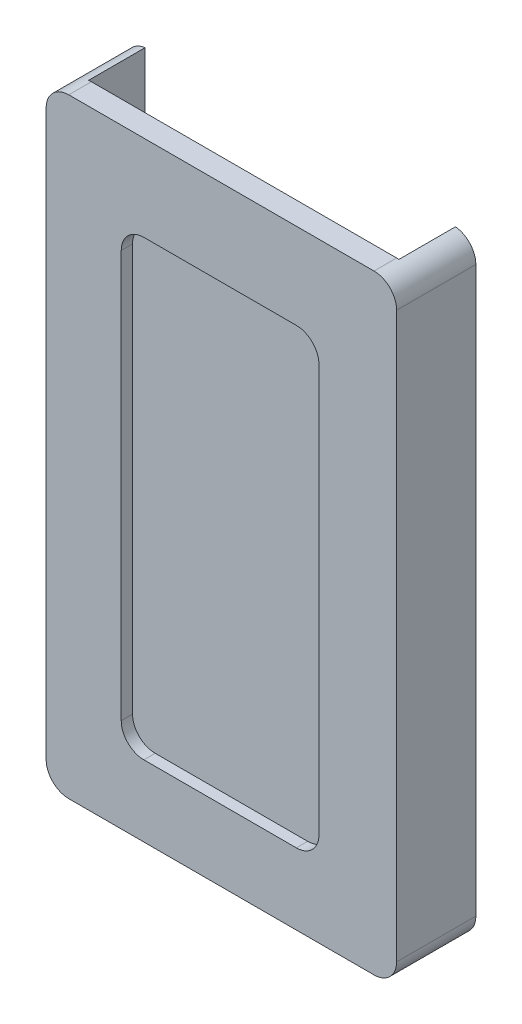
ISO-10303-21;
HEADER;
FILE_DESCRIPTION(('STEP AP214'),'2;1');
FILE_NAME('part.step','',(''),(''),'','','');
FILE_SCHEMA(('AUTOMOTIVE_DESIGN { 1 0 10303 214 1 1 1 1 }'));
ENDSEC;
DATA;
#1=APPLICATION_CONTEXT('core data for automotive mechanical design processes');
#2=APPLICATION_PROTOCOL_DEFINITION('international standard','automotive_design',2000,#1);
#3=PRODUCT_CONTEXT('',#1,'mechanical');
#4=PRODUCT('Part','Part','',(#3));
#5=PRODUCT_RELATED_PRODUCT_CATEGORY('part','',(#4));
#6=PRODUCT_DEFINITION_FORMATION('','',#4);
#7=PRODUCT_DEFINITION_CONTEXT('part definition',#1,'design');
#8=PRODUCT_DEFINITION('design','',#6,#7);
#9=PRODUCT_DEFINITION_SHAPE('','',#8);
#10=(LENGTH_UNIT() NAMED_UNIT(*) SI_UNIT(.MILLI.,.METRE.));
#11=(NAMED_UNIT(*) PLANE_ANGLE_UNIT() SI_UNIT($,.RADIAN.));
#12=(NAMED_UNIT(*) SI_UNIT($,.STERADIAN.) SOLID_ANGLE_UNIT());
#13=UNCERTAINTY_MEASURE_WITH_UNIT(LENGTH_MEASURE(1.E-05),#10,'distance_accuracy_value','');
#14=(GEOMETRIC_REPRESENTATION_CONTEXT(3) GLOBAL_UNCERTAINTY_ASSIGNED_CONTEXT((#13)) GLOBAL_UNIT_ASSIGNED_CONTEXT((#10,
#11,#12)) REPRESENTATION_CONTEXT('',''));
#15=CARTESIAN_POINT('',(0.,0.,0.));
#16=DIRECTION('',(0.,0.,1.));
#17=DIRECTION('',(1.,0.,0.));
#18=AXIS2_PLACEMENT_3D('',#15,#16,#17);
#19=CARTESIAN_POINT('',(0.,0.,17.));
#20=DIRECTION('',(0.,0.,-1.));
#21=DIRECTION('',(-1.,0.,0.));
#22=AXIS2_PLACEMENT_3D('',#19,#20,#21);
#23=PLANE('',#22);
#24=DIRECTION('',(1.,0.,0.));
#25=VECTOR('',#24,1.);
#26=CARTESIAN_POINT('',(36.6667067876056,-78.7564287427443,17.));
#27=LINE('',#26,#25);
#28=CARTESIAN_POINT('',(38.6667067876056,-78.7564287427443,17.));
#29=VERTEX_POINT('',#28);
#30=CARTESIAN_POINT('',(49.0700909856284,-78.7564287427443,17.));
#31=VERTEX_POINT('',#30);
#32=EDGE_CURVE('E265',#29,#31,#27,.T.);
#33=ORIENTED_EDGE('',*,*,#32,.F.);
#34=CARTESIAN_POINT('',(38.6667067876056,-76.7564287427443,17.));
#35=DIRECTION('',(0.,0.,-1.));
#36=DIRECTION('',(-1.,0.,0.));
#37=AXIS2_PLACEMENT_3D('',#34,#35,#36);
#38=CIRCLE('',#37,2.);
#39=CARTESIAN_POINT('',(36.6667067876056,-76.7564287427443,17.));
#40=VERTEX_POINT('',#39);
#41=EDGE_CURVE('E297',#29,#40,#38,.T.);
#42=ORIENTED_EDGE('',*,*,#41,.T.);
#43=DIRECTION('',(0.,-1.,0.));
#44=VECTOR('',#43,1.);
#45=CARTESIAN_POINT('',(36.6667067876056,-24.8876513413796,17.));
#46=LINE('',#45,#44);
#47=CARTESIAN_POINT('',(36.6667067876056,-26.8876513413796,17.));
#48=VERTEX_POINT('',#47);
#49=EDGE_CURVE('E270',#48,#40,#46,.T.);
#50=ORIENTED_EDGE('',*,*,#49,.F.);
#51=CARTESIAN_POINT('',(38.6667067876056,-26.8876513413796,17.));
#52=DIRECTION('',(0.,0.,-1.));
#53=DIRECTION('',(-1.,0.,0.));
#54=AXIS2_PLACEMENT_3D('',#51,#52,#53);
#55=CIRCLE('',#54,2.);
#56=CARTESIAN_POINT('',(38.4138867747377,-24.9036951823142,17.));
#57=VERTEX_POINT('',#56);
#58=EDGE_CURVE('E295',#48,#57,#55,.T.);
#59=ORIENTED_EDGE('',*,*,#58,.T.);
#60=DIRECTION('',(0.,-1.,0.));
#61=VECTOR('',#60,1.);
#62=CARTESIAN_POINT('',(38.4138867747377,-26.7599185660261,17.));
#63=LINE('',#62,#61);
#64=CARTESIAN_POINT('',(38.4138867747377,-77.1753131264585,17.));
#65=VERTEX_POINT('',#64);
#66=EDGE_CURVE('E250',#57,#65,#63,.T.);
#67=ORIENTED_EDGE('',*,*,#66,.T.);
#68=DIRECTION('',(1.,0.,0.));
#69=VECTOR('',#68,1.);
#70=CARTESIAN_POINT('',(38.4138867747377,-77.1753131264585,17.));
#71=LINE('',#70,#69);
#72=CARTESIAN_POINT('',(49.0700909856284,-77.1753131264585,17.));
#73=VERTEX_POINT('',#72);
#74=EDGE_CURVE('E257',#65,#73,#71,.T.);
#75=ORIENTED_EDGE('',*,*,#74,.T.);
#76=DIRECTION('',(0.,-1.,0.));
#77=VECTOR('',#76,1.);
#78=CARTESIAN_POINT('',(49.0700909856284,-77.1753131264585,17.));
#79=LINE('',#78,#77);
#80=EDGE_CURVE('E398',#73,#31,#79,.T.);
#81=ORIENTED_EDGE('',*,*,#80,.T.);
#82=EDGE_LOOP('',(#33,#42,#50,#59,#67,#75,#81));
#83=FACE_BOUND('',#82,.T.);
#84=ADVANCED_FACE('F59',(#83),#23,.T.);
#85=CARTESIAN_POINT('',(65.7954731172422,-26.7599185660261,22.));
#86=DIRECTION('',(1.,0.,0.));
#87=DIRECTION('',(0.,1.,0.));
#88=AXIS2_PLACEMENT_3D('',#85,#86,#87);
#89=PLANE('',#88);
#90=DIRECTION('',(0.,0.,1.));
#91=VECTOR('',#90,1.);
#92=CARTESIAN_POINT('',(65.7954731172422,-28.8876513413796,22.));
#93=LINE('',#92,#91);
#94=CARTESIAN_POINT('',(65.7954731172422,-28.8876513413796,17.));
#95=VERTEX_POINT('',#94);
#96=CARTESIAN_POINT('',(65.7954731172422,-28.8876513413796,22.));
#97=VERTEX_POINT('',#96);
#98=EDGE_CURVE('E437',#95,#97,#93,.T.);
#99=ORIENTED_EDGE('',*,*,#98,.F.);
#100=DIRECTION('',(0.,-1.,0.));
#101=VECTOR('',#100,1.);
#102=CARTESIAN_POINT('',(65.7954731172422,-26.7599185660261,17.));
#103=LINE('',#102,#101);
#104=CARTESIAN_POINT('',(65.7954731172423,-77.1753131264585,17.));
#105=VERTEX_POINT('',#104);
#106=EDGE_CURVE('E444',#95,#105,#103,.T.);
#107=ORIENTED_EDGE('',*,*,#106,.T.);
#108=DIRECTION('',(0.,0.,-1.));
#109=VECTOR('',#108,1.);
#110=CARTESIAN_POINT('',(65.7954731172423,-77.1753131264585,22.));
#111=LINE('',#110,#109);
#112=CARTESIAN_POINT('',(65.7954731172423,-77.1753131264585,22.));
#113=VERTEX_POINT('',#112);
#114=EDGE_CURVE('E258',#113,#105,#111,.T.);
#115=ORIENTED_EDGE('',*,*,#114,.F.);
#116=DIRECTION('',(0.,-1.,0.));
#117=VECTOR('',#116,1.);
#118=CARTESIAN_POINT('',(65.7954731172422,-26.7599185660261,22.));
#119=LINE('',#118,#117);
#120=EDGE_CURVE('E241',#97,#113,#119,.T.);
#121=ORIENTED_EDGE('',*,*,#120,.F.);
#122=EDGE_LOOP('',(#99,#107,#115,#121));
#123=FACE_BOUND('',#122,.T.);
#124=ADVANCED_FACE('F479',(#123),#89,.F.);
#125=DIRECTION('',(0.,-1.,0.));
#126=VECTOR('',#125,1.);
#127=CARTESIAN_POINT('',(67.6413600769126,-24.8876513413796,17.));
#128=LINE('',#127,#126);
#129=CARTESIAN_POINT('',(67.6413600769126,-26.8876513413796,17.));
#130=VERTEX_POINT('',#129);
#131=CARTESIAN_POINT('',(67.6413600769126,-76.7564287427443,17.));
#132=VERTEX_POINT('',#131);
#133=EDGE_CURVE('E267',#130,#132,#128,.T.);
#134=ORIENTED_EDGE('',*,*,#133,.T.);
#135=CARTESIAN_POINT('',(65.6413600769126,-76.7564287427443,17.));
#136=DIRECTION('',(0.,0.,-1.));
#137=DIRECTION('',(-1.,0.,0.));
#138=AXIS2_PLACEMENT_3D('',#135,#136,#137);
#139=CIRCLE('',#138,2.);
#140=CARTESIAN_POINT('',(65.6413600769126,-78.7564287427443,17.));
#141=VERTEX_POINT('',#140);
#142=EDGE_CURVE('E280',#132,#141,#139,.T.);
#143=ORIENTED_EDGE('',*,*,#142,.T.);
#144=CARTESIAN_POINT('',(55.1900802237575,-78.7564287427443,17.));
#145=VERTEX_POINT('',#144);
#146=EDGE_CURVE('E260',#145,#141,#27,.T.);
#147=ORIENTED_EDGE('',*,*,#146,.F.);
#148=DIRECTION('',(0.,-1.,0.));
#149=VECTOR('',#148,1.);
#150=CARTESIAN_POINT('',(55.1900802237575,-77.1753131264585,17.));
#151=LINE('',#150,#149);
#152=CARTESIAN_POINT('',(55.1900802237575,-77.1753131264585,17.));
#153=VERTEX_POINT('',#152);
#154=EDGE_CURVE('E404',#153,#145,#151,.T.);
#155=ORIENTED_EDGE('',*,*,#154,.F.);
#156=EDGE_CURVE('E441',#153,#105,#71,.T.);
#157=ORIENTED_EDGE('',*,*,#156,.T.);
#158=ORIENTED_EDGE('',*,*,#106,.F.);
#159=DIRECTION('',(-1.,0.,0.));
#160=VECTOR('',#159,1.);
#161=CARTESIAN_POINT('',(38.4138867747377,-28.8876513413796,17.));
#162=LINE('',#161,#160);
#163=CARTESIAN_POINT('',(65.8413296026054,-28.8876513413796,17.));
#164=VERTEX_POINT('',#163);
#165=EDGE_CURVE('E431',#164,#95,#162,.T.);
#166=ORIENTED_EDGE('',*,*,#165,.F.);
#167=DIRECTION('',(0.,1.,0.));
#168=VECTOR('',#167,1.);
#169=CARTESIAN_POINT('',(65.8413296026054,-28.8876513413796,17.));
#170=LINE('',#169,#168);
#171=CARTESIAN_POINT('',(65.8413296026054,-24.8976734046189,17.));
#172=VERTEX_POINT('',#171);
#173=EDGE_CURVE('E434',#164,#172,#170,.T.);
#174=ORIENTED_EDGE('',*,*,#173,.T.);
#175=CARTESIAN_POINT('',(65.6413600769126,-26.8876513413796,17.));
#176=DIRECTION('',(0.,0.,-1.));
#177=DIRECTION('',(-1.,0.,0.));
#178=AXIS2_PLACEMENT_3D('',#175,#176,#177);
#179=CIRCLE('',#178,2.);
#180=EDGE_CURVE('E278',#172,#130,#179,.T.);
#181=ORIENTED_EDGE('',*,*,#180,.T.);
#182=EDGE_LOOP('',(#134,#143,#147,#155,#157,#158,#166,#174,#181));
#183=FACE_BOUND('',#182,.T.);
#184=ADVANCED_FACE('F475',(#183),#23,.T.);
#185=CARTESIAN_POINT('',(36.6667067876056,-78.7564287427443,22.));
#186=DIRECTION('',(0.,1.,0.));
#187=DIRECTION('',(0.,0.,1.));
#188=AXIS2_PLACEMENT_3D('',#185,#186,#187);
#189=PLANE('',#188);
#190=ORIENTED_EDGE('',*,*,#146,.T.);
#191=DIRECTION('',(0.,0.,-1.));
#192=VECTOR('',#191,1.);
#193=CARTESIAN_POINT('',(65.6413600769126,-78.7564287427443,24.));
#194=LINE('',#193,#192);
#195=CARTESIAN_POINT('',(65.6413600769126,-78.7564287427443,24.));
#196=VERTEX_POINT('',#195);
#197=EDGE_CURVE('E285',#141,#196,#194,.F.);
#198=ORIENTED_EDGE('',*,*,#197,.T.);
#199=DIRECTION('',(1.,0.,0.));
#200=VECTOR('',#199,1.);
#201=CARTESIAN_POINT('',(36.6667067876056,-78.7564287427443,24.));
#202=LINE('',#201,#200);
#203=CARTESIAN_POINT('',(38.6667067876056,-78.7564287427443,24.));
#204=VERTEX_POINT('',#203);
#205=EDGE_CURVE('E390',#204,#196,#202,.T.);
#206=ORIENTED_EDGE('',*,*,#205,.F.);
#207=DIRECTION('',(0.,0.,-1.));
#208=VECTOR('',#207,1.);
#209=CARTESIAN_POINT('',(38.6667067876056,-78.7564287427443,22.));
#210=LINE('',#209,#208);
#211=EDGE_CURVE('E282',#204,#29,#210,.T.);
#212=ORIENTED_EDGE('',*,*,#211,.T.);
#213=ORIENTED_EDGE('',*,*,#32,.T.);
#214=DIRECTION('',(0.,0.,-1.));
#215=VECTOR('',#214,1.);
#216=CARTESIAN_POINT('',(49.0700909856284,-78.7564287427443,20.));
#217=LINE('',#216,#215);
#218=CARTESIAN_POINT('',(49.0700909856284,-78.7564287427443,20.));
#219=VERTEX_POINT('',#218);
#220=EDGE_CURVE('E412',#219,#31,#217,.T.);
#221=ORIENTED_EDGE('',*,*,#220,.F.);
#222=DIRECTION('',(-1.,0.,0.));
#223=VECTOR('',#222,1.);
#224=CARTESIAN_POINT('',(55.1900802237575,-78.7564287427443,20.));
#225=LINE('',#224,#223);
#226=CARTESIAN_POINT('',(55.1900802237575,-78.7564287427443,20.));
#227=VERTEX_POINT('',#226);
#228=EDGE_CURVE('E400',#227,#219,#225,.T.);
#229=ORIENTED_EDGE('',*,*,#228,.F.);
#230=DIRECTION('',(0.,0.,-1.));
#231=VECTOR('',#230,1.);
#232=CARTESIAN_POINT('',(55.1900802237575,-78.7564287427443,20.));
#233=LINE('',#232,#231);
#234=EDGE_CURVE('E416',#227,#145,#233,.T.);
#235=ORIENTED_EDGE('',*,*,#234,.T.);
#236=EDGE_LOOP('',(#190,#198,#206,#212,#213,#221,#229,#235));
#237=FACE_BOUND('',#236,.T.);
#238=ADVANCED_FACE('F486',(#237),#189,.F.);
#239=CARTESIAN_POINT('',(67.6413600769126,-24.8876513413796,22.));
#240=DIRECTION('',(1.,0.,0.));
#241=DIRECTION('',(0.,0.,-1.));
#242=AXIS2_PLACEMENT_3D('',#239,#240,#241);
#243=PLANE('',#242);
#244=DIRECTION('',(0.,1.,0.));
#245=VECTOR('',#244,1.);
#246=CARTESIAN_POINT('',(67.6413600769126,-24.8876513413796,24.));
#247=LINE('',#246,#245);
#248=CARTESIAN_POINT('',(67.6413600769126,-76.7564287427443,24.));
#249=VERTEX_POINT('',#248);
#250=CARTESIAN_POINT('',(67.6413600769126,-26.8876513413796,24.));
#251=VERTEX_POINT('',#250);
#252=EDGE_CURVE('E393',#249,#251,#247,.T.);
#253=ORIENTED_EDGE('',*,*,#252,.F.);
#254=DIRECTION('',(0.,0.,-1.));
#255=VECTOR('',#254,1.);
#256=CARTESIAN_POINT('',(67.6413600769126,-76.7564287427443,17.));
#257=LINE('',#256,#255);
#258=EDGE_CURVE('E275',#249,#132,#257,.T.);
#259=ORIENTED_EDGE('',*,*,#258,.T.);
#260=ORIENTED_EDGE('',*,*,#133,.F.);
#261=DIRECTION('',(0.,0.,-1.));
#262=VECTOR('',#261,1.);
#263=CARTESIAN_POINT('',(67.6413600769126,-26.8876513413796,22.));
#264=LINE('',#263,#262);
#265=EDGE_CURVE('E273',#130,#251,#264,.F.);
#266=ORIENTED_EDGE('',*,*,#265,.T.);
#267=EDGE_LOOP('',(#253,#259,#260,#266));
#268=FACE_BOUND('',#267,.T.);
#269=ADVANCED_FACE('F499',(#268),#243,.T.);
#270=CARTESIAN_POINT('',(36.6667067876056,-24.8876513413796,22.));
#271=DIRECTION('',(0.,1.,0.));
#272=DIRECTION('',(0.,0.,1.));
#273=AXIS2_PLACEMENT_3D('',#270,#271,#272);
#274=PLANE('',#273);
#275=DIRECTION('',(-1.,0.,0.));
#276=VECTOR('',#275,1.);
#277=CARTESIAN_POINT('',(36.6667067876056,-24.8876513413796,22.));
#278=LINE('',#277,#276);
#279=CARTESIAN_POINT('',(65.6413600769126,-24.8876513413796,22.));
#280=VERTEX_POINT('',#279);
#281=CARTESIAN_POINT('',(38.6667067876056,-24.8876513413796,22.));
#282=VERTEX_POINT('',#281);
#283=EDGE_CURVE('E372',#280,#282,#278,.T.);
#284=ORIENTED_EDGE('',*,*,#283,.T.);
#285=DIRECTION('',(0.,0.,-1.));
#286=VECTOR('',#285,1.);
#287=CARTESIAN_POINT('',(38.6667067876056,-24.8876513413796,24.));
#288=LINE('',#287,#286);
#289=CARTESIAN_POINT('',(38.6667067876056,-24.8876513413796,24.));
#290=VERTEX_POINT('',#289);
#291=EDGE_CURVE('E312',#282,#290,#288,.F.);
#292=ORIENTED_EDGE('',*,*,#291,.T.);
#293=DIRECTION('',(-1.,0.,0.));
#294=VECTOR('',#293,1.);
#295=CARTESIAN_POINT('',(36.6667067876056,-24.8876513413796,24.));
#296=LINE('',#295,#294);
#297=CARTESIAN_POINT('',(65.6413600769126,-24.8876513413796,24.));
#298=VERTEX_POINT('',#297);
#299=EDGE_CURVE('E396',#298,#290,#296,.T.);
#300=ORIENTED_EDGE('',*,*,#299,.F.);
#301=DIRECTION('',(0.,0.,-1.));
#302=VECTOR('',#301,1.);
#303=CARTESIAN_POINT('',(65.6413600769126,-24.8876513413796,22.));
#304=LINE('',#303,#302);
#305=EDGE_CURVE('E309',#298,#280,#304,.T.);
#306=ORIENTED_EDGE('',*,*,#305,.T.);
#307=EDGE_LOOP('',(#284,#292,#300,#306));
#308=FACE_BOUND('',#307,.T.);
#309=ADVANCED_FACE('F459',(#308),#274,.T.);
#310=CARTESIAN_POINT('',(36.6667067876056,-24.8876513413796,22.));
#311=DIRECTION('',(1.,0.,0.));
#312=DIRECTION('',(0.,0.,-1.));
#313=AXIS2_PLACEMENT_3D('',#310,#311,#312);
#314=PLANE('',#313);
#315=ORIENTED_EDGE('',*,*,#49,.T.);
#316=DIRECTION('',(0.,0.,-1.));
#317=VECTOR('',#316,1.);
#318=CARTESIAN_POINT('',(36.6667067876056,-76.7564287427443,22.));
#319=LINE('',#318,#317);
#320=CARTESIAN_POINT('',(36.6667067876056,-76.7564287427443,24.));
#321=VERTEX_POINT('',#320);
#322=EDGE_CURVE('E302',#40,#321,#319,.F.);
#323=ORIENTED_EDGE('',*,*,#322,.T.);
#324=DIRECTION('',(0.,-1.,0.));
#325=VECTOR('',#324,1.);
#326=CARTESIAN_POINT('',(36.6667067876056,-24.8876513413796,24.));
#327=LINE('',#326,#325);
#328=CARTESIAN_POINT('',(36.6667067876056,-26.8876513413796,24.));
#329=VERTEX_POINT('',#328);
#330=EDGE_CURVE('E375',#329,#321,#327,.T.);
#331=ORIENTED_EDGE('',*,*,#330,.F.);
#332=DIRECTION('',(0.,0.,-1.));
#333=VECTOR('',#332,1.);
#334=CARTESIAN_POINT('',(36.6667067876056,-26.8876513413796,17.));
#335=LINE('',#334,#333);
#336=EDGE_CURVE('E299',#329,#48,#335,.T.);
#337=ORIENTED_EDGE('',*,*,#336,.T.);
#338=EDGE_LOOP('',(#315,#323,#331,#337));
#339=FACE_BOUND('',#338,.T.);
#340=ADVANCED_FACE('F492',(#339),#314,.F.);
#341=CARTESIAN_POINT('',(38.4138867747377,-77.1753131264585,22.));
#342=DIRECTION('',(0.,1.,0.));
#343=DIRECTION('',(0.,0.,1.));
#344=AXIS2_PLACEMENT_3D('',#341,#342,#343);
#345=PLANE('',#344);
#346=DIRECTION('',(0.,0.,-1.));
#347=VECTOR('',#346,1.);
#348=CARTESIAN_POINT('',(55.1900802237575,-77.1753131264585,20.));
#349=LINE('',#348,#347);
#350=CARTESIAN_POINT('',(55.1900802237575,-77.1753131264585,20.));
#351=VERTEX_POINT('',#350);
#352=EDGE_CURVE('E420',#351,#153,#349,.T.);
#353=ORIENTED_EDGE('',*,*,#352,.F.);
#354=DIRECTION('',(-1.,0.,0.));
#355=VECTOR('',#354,1.);
#356=CARTESIAN_POINT('',(55.1900802237575,-77.1753131264585,20.));
#357=LINE('',#356,#355);
#358=CARTESIAN_POINT('',(49.0700909856284,-77.1753131264585,20.));
#359=VERTEX_POINT('',#358);
#360=EDGE_CURVE('E406',#351,#359,#357,.T.);
#361=ORIENTED_EDGE('',*,*,#360,.T.);
#362=DIRECTION('',(0.,0.,-1.));
#363=VECTOR('',#362,1.);
#364=CARTESIAN_POINT('',(49.0700909856284,-77.1753131264585,20.));
#365=LINE('',#364,#363);
#366=EDGE_CURVE('E422',#359,#73,#365,.T.);
#367=ORIENTED_EDGE('',*,*,#366,.T.);
#368=ORIENTED_EDGE('',*,*,#74,.F.);
#369=DIRECTION('',(0.,0.,-1.));
#370=VECTOR('',#369,1.);
#371=CARTESIAN_POINT('',(38.4138867747377,-77.1753131264585,22.));
#372=LINE('',#371,#370);
#373=CARTESIAN_POINT('',(38.4138867747377,-77.1753131264585,22.));
#374=VERTEX_POINT('',#373);
#375=EDGE_CURVE('E236',#374,#65,#372,.T.);
#376=ORIENTED_EDGE('',*,*,#375,.F.);
#377=DIRECTION('',(1.,0.,0.));
#378=VECTOR('',#377,1.);
#379=CARTESIAN_POINT('',(38.4138867747377,-77.1753131264585,22.));
#380=LINE('',#379,#378);
#381=EDGE_CURVE('E244',#374,#113,#380,.T.);
#382=ORIENTED_EDGE('',*,*,#381,.T.);
#383=ORIENTED_EDGE('',*,*,#114,.T.);
#384=ORIENTED_EDGE('',*,*,#156,.F.);
#385=EDGE_LOOP('',(#353,#361,#367,#368,#376,#382,#383,#384));
#386=FACE_BOUND('',#385,.T.);
#387=ADVANCED_FACE('F254',(#386),#345,.T.);
#388=CARTESIAN_POINT('',(38.4138867747377,-26.7599185660261,22.));
#389=DIRECTION('',(1.,0.,0.));
#390=DIRECTION('',(0.,0.,-1.));
#391=AXIS2_PLACEMENT_3D('',#388,#389,#390);
#392=PLANE('',#391);
#393=ORIENTED_EDGE('',*,*,#66,.F.);
#394=DIRECTION('',(0.,0.,1.));
#395=VECTOR('',#394,1.);
#396=CARTESIAN_POINT('',(38.4138867747377,-24.9036951823142,17.));
#397=LINE('',#396,#395);
#398=CARTESIAN_POINT('',(38.4138867747377,-24.9036951823142,22.));
#399=VERTEX_POINT('',#398);
#400=EDGE_CURVE('E238',#57,#399,#397,.T.);
#401=ORIENTED_EDGE('',*,*,#400,.T.);
#402=DIRECTION('',(0.,-1.,0.));
#403=VECTOR('',#402,1.);
#404=CARTESIAN_POINT('',(38.4138867747377,-26.7599185660261,22.));
#405=LINE('',#404,#403);
#406=EDGE_CURVE('E231',#399,#374,#405,.T.);
#407=ORIENTED_EDGE('',*,*,#406,.T.);
#408=ORIENTED_EDGE('',*,*,#375,.T.);
#409=EDGE_LOOP('',(#393,#401,#407,#408));
#410=FACE_BOUND('',#409,.T.);
#411=ADVANCED_FACE('F234',(#410),#392,.T.);
#412=CARTESIAN_POINT('',(0.,-28.8876513413796,0.));
#413=DIRECTION('',(0.,1.,0.));
#414=DIRECTION('',(0.,0.,1.));
#415=AXIS2_PLACEMENT_3D('',#412,#413,#414);
#416=PLANE('',#415);
#417=ORIENTED_EDGE('',*,*,#98,.T.);
#418=DIRECTION('',(1.,0.,0.));
#419=VECTOR('',#418,1.);
#420=CARTESIAN_POINT('',(38.4138867747377,-28.8876513413796,22.));
#421=LINE('',#420,#419);
#422=CARTESIAN_POINT('',(65.8413296026054,-28.8876513413796,22.));
#423=VERTEX_POINT('',#422);
#424=EDGE_CURVE('E419',#97,#423,#421,.T.);
#425=ORIENTED_EDGE('',*,*,#424,.T.);
#426=DIRECTION('',(0.,0.,-1.));
#427=VECTOR('',#426,1.);
#428=CARTESIAN_POINT('',(65.8413296026054,-28.8876513413796,17.));
#429=LINE('',#428,#427);
#430=EDGE_CURVE('E428',#423,#164,#429,.T.);
#431=ORIENTED_EDGE('',*,*,#430,.T.);
#432=ORIENTED_EDGE('',*,*,#165,.T.);
#433=EDGE_LOOP('',(#417,#425,#431,#432));
#434=FACE_BOUND('',#433,.T.);
#435=ADVANCED_FACE('F473',(#434),#416,.T.);
#436=CARTESIAN_POINT('',(65.8413296026054,-28.8876513413796,17.));
#437=DIRECTION('',(1.,0.,0.));
#438=DIRECTION('',(0.,0.,-1.));
#439=AXIS2_PLACEMENT_3D('',#436,#437,#438);
#440=PLANE('',#439);
#441=DIRECTION('',(0.,1.,0.));
#442=VECTOR('',#441,1.);
#443=CARTESIAN_POINT('',(65.8413296026054,-28.8876513413796,22.));
#444=LINE('',#443,#442);
#445=CARTESIAN_POINT('',(65.8413296026054,-24.8976734046189,22.));
#446=VERTEX_POINT('',#445);
#447=EDGE_CURVE('E433',#423,#446,#444,.T.);
#448=ORIENTED_EDGE('',*,*,#447,.T.);
#449=DIRECTION('',(0.,0.,-1.));
#450=VECTOR('',#449,1.);
#451=CARTESIAN_POINT('',(65.8413296026054,-24.8976734046189,22.));
#452=LINE('',#451,#450);
#453=EDGE_CURVE('E314',#446,#172,#452,.T.);
#454=ORIENTED_EDGE('',*,*,#453,.T.);
#455=ORIENTED_EDGE('',*,*,#173,.F.);
#456=ORIENTED_EDGE('',*,*,#430,.F.);
#457=EDGE_LOOP('',(#448,#454,#455,#456));
#458=FACE_BOUND('',#457,.T.);
#459=ADVANCED_FACE('F470',(#458),#440,.F.);
#460=CARTESIAN_POINT('',(55.1900802237575,-77.1753131264585,20.));
#461=DIRECTION('',(1.,0.,0.));
#462=DIRECTION('',(0.,0.,-1.));
#463=AXIS2_PLACEMENT_3D('',#460,#461,#462);
#464=PLANE('',#463);
#465=ORIENTED_EDGE('',*,*,#154,.T.);
#466=ORIENTED_EDGE('',*,*,#234,.F.);
#467=DIRECTION('',(0.,-1.,0.));
#468=VECTOR('',#467,1.);
#469=CARTESIAN_POINT('',(55.1900802237575,-77.1753131264585,20.));
#470=LINE('',#469,#468);
#471=EDGE_CURVE('E409',#351,#227,#470,.T.);
#472=ORIENTED_EDGE('',*,*,#471,.F.);
#473=ORIENTED_EDGE('',*,*,#352,.T.);
#474=EDGE_LOOP('',(#465,#466,#472,#473));
#475=FACE_BOUND('',#474,.T.);
#476=ADVANCED_FACE('F568',(#475),#464,.F.);
#477=CARTESIAN_POINT('',(49.0700909856284,-77.1753131264585,20.));
#478=DIRECTION('',(1.,0.,0.));
#479=DIRECTION('',(0.,0.,-1.));
#480=AXIS2_PLACEMENT_3D('',#477,#478,#479);
#481=PLANE('',#480);
#482=ORIENTED_EDGE('',*,*,#80,.F.);
#483=ORIENTED_EDGE('',*,*,#366,.F.);
#484=DIRECTION('',(0.,-1.,0.));
#485=VECTOR('',#484,1.);
#486=CARTESIAN_POINT('',(49.0700909856284,-77.1753131264585,20.));
#487=LINE('',#486,#485);
#488=EDGE_CURVE('E403',#359,#219,#487,.T.);
#489=ORIENTED_EDGE('',*,*,#488,.T.);
#490=ORIENTED_EDGE('',*,*,#220,.T.);
#491=EDGE_LOOP('',(#482,#483,#489,#490));
#492=FACE_BOUND('',#491,.T.);
#493=ADVANCED_FACE('F566',(#492),#481,.T.);
#494=CARTESIAN_POINT('',(0.,0.,20.));
#495=DIRECTION('',(0.,0.,1.));
#496=DIRECTION('',(1.,0.,0.));
#497=AXIS2_PLACEMENT_3D('',#494,#495,#496);
#498=PLANE('',#497);
#499=ORIENTED_EDGE('',*,*,#228,.T.);
#500=ORIENTED_EDGE('',*,*,#488,.F.);
#501=ORIENTED_EDGE('',*,*,#360,.F.);
#502=ORIENTED_EDGE('',*,*,#471,.T.);
#503=EDGE_LOOP('',(#499,#500,#501,#502));
#504=FACE_BOUND('',#503,.T.);
#505=ADVANCED_FACE('F561',(#504),#498,.F.);
#506=CARTESIAN_POINT('',(0.,0.,24.));
#507=DIRECTION('',(0.,0.,1.));
#508=DIRECTION('',(1.,0.,0.));
#509=AXIS2_PLACEMENT_3D('',#506,#507,#508);
#510=PLANE('',#509);
#511=DIRECTION('',(0.,-1.,0.));
#512=VECTOR('',#511,1.);
#513=CARTESIAN_POINT('',(43.3020672379144,-32.4774415052826,24.));
#514=LINE('',#513,#512);
#515=CARTESIAN_POINT('',(43.3020672379144,-34.4774415052826,24.));
#516=VERTEX_POINT('',#515);
#517=CARTESIAN_POINT('',(43.3020672379144,-70.463909486633,24.));
#518=VERTEX_POINT('',#517);
#519=EDGE_CURVE('E381',#516,#518,#514,.T.);
#520=ORIENTED_EDGE('',*,*,#519,.F.);
#521=CARTESIAN_POINT('',(45.3020672379144,-34.4774415052826,24.));
#522=DIRECTION('',(0.,0.,1.));
#523=DIRECTION('',(1.,0.,0.));
#524=AXIS2_PLACEMENT_3D('',#521,#522,#523);
#525=CIRCLE('',#524,2.);
#526=CARTESIAN_POINT('',(45.3020672379144,-32.4774415052826,24.));
#527=VERTEX_POINT('',#526);
#528=EDGE_CURVE('E12',#516,#527,#525,.F.);
#529=ORIENTED_EDGE('',*,*,#528,.T.);
#530=DIRECTION('',(-1.,0.,0.));
#531=VECTOR('',#530,1.);
#532=CARTESIAN_POINT('',(43.3020672379144,-32.4774415052826,24.));
#533=LINE('',#532,#531);
#534=CARTESIAN_POINT('',(58.7770694664053,-32.4774415052826,24.));
#535=VERTEX_POINT('',#534);
#536=EDGE_CURVE('E351',#535,#527,#533,.T.);
#537=ORIENTED_EDGE('',*,*,#536,.F.);
#538=CARTESIAN_POINT('',(58.7770694664053,-34.4774415052826,24.));
#539=DIRECTION('',(0.,0.,1.));
#540=DIRECTION('',(1.,0.,0.));
#541=AXIS2_PLACEMENT_3D('',#538,#539,#540);
#542=CIRCLE('',#541,2.);
#543=CARTESIAN_POINT('',(60.7770694664053,-34.4774415052826,24.));
#544=VERTEX_POINT('',#543);
#545=EDGE_CURVE('E67',#535,#544,#542,.F.);
#546=ORIENTED_EDGE('',*,*,#545,.T.);
#547=DIRECTION('',(0.,1.,0.));
#548=VECTOR('',#547,1.);
#549=CARTESIAN_POINT('',(60.7770694664053,-32.4774415052826,24.));
#550=LINE('',#549,#548);
#551=CARTESIAN_POINT('',(60.7770694664053,-70.463909486633,24.));
#552=VERTEX_POINT('',#551);
#553=EDGE_CURVE('E350',#552,#544,#550,.T.);
#554=ORIENTED_EDGE('',*,*,#553,.F.);
#555=CARTESIAN_POINT('',(58.7770694664053,-70.463909486633,24.));
#556=DIRECTION('',(0.,0.,1.));
#557=DIRECTION('',(1.,0.,0.));
#558=AXIS2_PLACEMENT_3D('',#555,#556,#557);
#559=CIRCLE('',#558,2.);
#560=CARTESIAN_POINT('',(58.7770694664053,-72.463909486633,24.));
#561=VERTEX_POINT('',#560);
#562=EDGE_CURVE('E345',#552,#561,#559,.F.);
#563=ORIENTED_EDGE('',*,*,#562,.T.);
#564=DIRECTION('',(1.,0.,0.));
#565=VECTOR('',#564,1.);
#566=CARTESIAN_POINT('',(43.3020672379144,-72.463909486633,24.));
#567=LINE('',#566,#565);
#568=CARTESIAN_POINT('',(45.3020672379144,-72.463909486633,24.));
#569=VERTEX_POINT('',#568);
#570=EDGE_CURVE('E357',#569,#561,#567,.T.);
#571=ORIENTED_EDGE('',*,*,#570,.F.);
#572=CARTESIAN_POINT('',(45.3020672379144,-70.463909486633,24.));
#573=DIRECTION('',(0.,0.,1.));
#574=DIRECTION('',(1.,0.,0.));
#575=AXIS2_PLACEMENT_3D('',#572,#573,#574);
#576=CIRCLE('',#575,2.);
#577=EDGE_CURVE('E343',#569,#518,#576,.F.);
#578=ORIENTED_EDGE('',*,*,#577,.T.);
#579=EDGE_LOOP('',(#520,#529,#537,#546,#554,#563,#571,#578));
#580=FACE_BOUND('',#579,.T.);
#581=ORIENTED_EDGE('',*,*,#205,.T.);
#582=CARTESIAN_POINT('',(65.6413600769126,-76.7564287427443,24.));
#583=DIRECTION('',(0.,0.,1.));
#584=DIRECTION('',(1.,0.,0.));
#585=AXIS2_PLACEMENT_3D('',#582,#583,#584);
#586=CIRCLE('',#585,2.);
#587=EDGE_CURVE('E293',#196,#249,#586,.T.);
#588=ORIENTED_EDGE('',*,*,#587,.T.);
#589=ORIENTED_EDGE('',*,*,#252,.T.);
#590=CARTESIAN_POINT('',(65.6413600769126,-26.8876513413796,24.));
#591=DIRECTION('',(0.,0.,1.));
#592=DIRECTION('',(1.,0.,0.));
#593=AXIS2_PLACEMENT_3D('',#590,#591,#592);
#594=CIRCLE('',#593,2.);
#595=EDGE_CURVE('E287',#251,#298,#594,.T.);
#596=ORIENTED_EDGE('',*,*,#595,.T.);
#597=ORIENTED_EDGE('',*,*,#299,.T.);
#598=CARTESIAN_POINT('',(38.6667067876056,-26.8876513413796,24.));
#599=DIRECTION('',(0.,0.,1.));
#600=DIRECTION('',(1.,0.,0.));
#601=AXIS2_PLACEMENT_3D('',#598,#599,#600);
#602=CIRCLE('',#601,2.);
#603=EDGE_CURVE('E289',#290,#329,#602,.T.);
#604=ORIENTED_EDGE('',*,*,#603,.T.);
#605=ORIENTED_EDGE('',*,*,#330,.T.);
#606=CARTESIAN_POINT('',(38.6667067876056,-76.7564287427443,24.));
#607=DIRECTION('',(0.,0.,1.));
#608=DIRECTION('',(1.,0.,0.));
#609=AXIS2_PLACEMENT_3D('',#606,#607,#608);
#610=CIRCLE('',#609,2.);
#611=EDGE_CURVE('E291',#321,#204,#610,.T.);
#612=ORIENTED_EDGE('',*,*,#611,.T.);
#613=EDGE_LOOP('',(#581,#588,#589,#596,#597,#604,#605,#612));
#614=FACE_BOUND('',#613,.T.);
#615=ADVANCED_FACE('F348',(#580,#614),#510,.T.);
#616=CARTESIAN_POINT('',(0.,0.,22.));
#617=DIRECTION('',(0.,0.,1.));
#618=DIRECTION('',(1.,0.,0.));
#619=AXIS2_PLACEMENT_3D('',#616,#617,#618);
#620=PLANE('',#619);
#621=ORIENTED_EDGE('',*,*,#406,.F.);
#622=CARTESIAN_POINT('',(38.6667067876056,-26.8876513413796,22.));
#623=DIRECTION('',(0.,0.,1.));
#624=DIRECTION('',(1.,0.,0.));
#625=AXIS2_PLACEMENT_3D('',#622,#623,#624);
#626=CIRCLE('',#625,2.);
#627=EDGE_CURVE('E307',#399,#282,#626,.F.);
#628=ORIENTED_EDGE('',*,*,#627,.T.);
#629=ORIENTED_EDGE('',*,*,#283,.F.);
#630=CARTESIAN_POINT('',(65.6413600769126,-26.8876513413796,22.));
#631=DIRECTION('',(0.,0.,1.));
#632=DIRECTION('',(1.,0.,0.));
#633=AXIS2_PLACEMENT_3D('',#630,#631,#632);
#634=CIRCLE('',#633,2.);
#635=EDGE_CURVE('E305',#280,#446,#634,.F.);
#636=ORIENTED_EDGE('',*,*,#635,.T.);
#637=ORIENTED_EDGE('',*,*,#447,.F.);
#638=ORIENTED_EDGE('',*,*,#424,.F.);
#639=ORIENTED_EDGE('',*,*,#120,.T.);
#640=ORIENTED_EDGE('',*,*,#381,.F.);
#641=EDGE_LOOP('',(#621,#628,#629,#636,#637,#638,#639,#640));
#642=FACE_BOUND('',#641,.T.);
#643=ADVANCED_FACE('F245',(#642),#620,.F.);
#644=CARTESIAN_POINT('',(43.3020672379144,-32.4774415052826,23.));
#645=DIRECTION('',(-1.,0.,0.));
#646=DIRECTION('',(0.,0.,1.));
#647=AXIS2_PLACEMENT_3D('',#644,#645,#646);
#648=PLANE('',#647);
#649=ORIENTED_EDGE('',*,*,#519,.T.);
#650=DIRECTION('',(0.,0.,1.));
#651=VECTOR('',#650,1.);
#652=CARTESIAN_POINT('',(43.3020672379144,-70.463909486633,23.));
#653=LINE('',#652,#651);
#654=CARTESIAN_POINT('',(43.3020672379144,-70.463909486633,23.));
#655=VERTEX_POINT('',#654);
#656=EDGE_CURVE('E324',#518,#655,#653,.F.);
#657=ORIENTED_EDGE('',*,*,#656,.T.);
#658=DIRECTION('',(0.,-1.,0.));
#659=VECTOR('',#658,1.);
#660=CARTESIAN_POINT('',(43.3020672379144,-32.4774415052826,23.));
#661=LINE('',#660,#659);
#662=CARTESIAN_POINT('',(43.3020672379144,-34.4774415052826,23.));
#663=VERTEX_POINT('',#662);
#664=EDGE_CURVE('E387',#663,#655,#661,.T.);
#665=ORIENTED_EDGE('',*,*,#664,.F.);
#666=DIRECTION('',(0.,0.,1.));
#667=VECTOR('',#666,1.);
#668=CARTESIAN_POINT('',(43.3020672379144,-34.4774415052826,24.));
#669=LINE('',#668,#667);
#670=EDGE_CURVE('E321',#663,#516,#669,.T.);
#671=ORIENTED_EDGE('',*,*,#670,.T.);
#672=EDGE_LOOP('',(#649,#657,#665,#671));
#673=FACE_BOUND('',#672,.T.);
#674=ADVANCED_FACE('F536',(#673),#648,.F.);
#675=CARTESIAN_POINT('',(43.3020672379144,-32.4774415052826,23.));
#676=DIRECTION('',(0.,1.,0.));
#677=DIRECTION('',(0.,0.,1.));
#678=AXIS2_PLACEMENT_3D('',#675,#676,#677);
#679=PLANE('',#678);
#680=DIRECTION('',(-1.,0.,0.));
#681=VECTOR('',#680,1.);
#682=CARTESIAN_POINT('',(43.3020672379144,-32.4774415052826,23.));
#683=LINE('',#682,#681);
#684=CARTESIAN_POINT('',(58.7770694664053,-32.4774415052826,23.));
#685=VERTEX_POINT('',#684);
#686=CARTESIAN_POINT('',(45.3020672379144,-32.4774415052826,23.));
#687=VERTEX_POINT('',#686);
#688=EDGE_CURVE('E366',#685,#687,#683,.T.);
#689=ORIENTED_EDGE('',*,*,#688,.F.);
#690=DIRECTION('',(0.,0.,1.));
#691=VECTOR('',#690,1.);
#692=CARTESIAN_POINT('',(58.7770694664053,-32.4774415052826,24.));
#693=LINE('',#692,#691);
#694=EDGE_CURVE('E341',#685,#535,#693,.T.);
#695=ORIENTED_EDGE('',*,*,#694,.T.);
#696=ORIENTED_EDGE('',*,*,#536,.T.);
#697=DIRECTION('',(0.,0.,1.));
#698=VECTOR('',#697,1.);
#699=CARTESIAN_POINT('',(45.3020672379144,-32.4774415052826,23.));
#700=LINE('',#699,#698);
#701=EDGE_CURVE('E339',#527,#687,#700,.F.);
#702=ORIENTED_EDGE('',*,*,#701,.T.);
#703=EDGE_LOOP('',(#689,#695,#696,#702));
#704=FACE_BOUND('',#703,.T.);
#705=ADVANCED_FACE('F370',(#704),#679,.F.);
#706=CARTESIAN_POINT('',(60.7770694664053,-32.4774415052826,23.));
#707=DIRECTION('',(1.,0.,0.));
#708=DIRECTION('',(0.,0.,-1.));
#709=AXIS2_PLACEMENT_3D('',#706,#707,#708);
#710=PLANE('',#709);
#711=DIRECTION('',(0.,1.,0.));
#712=VECTOR('',#711,1.);
#713=CARTESIAN_POINT('',(60.7770694664053,-32.4774415052826,23.));
#714=LINE('',#713,#712);
#715=CARTESIAN_POINT('',(60.7770694664053,-70.463909486633,23.));
#716=VERTEX_POINT('',#715);
#717=CARTESIAN_POINT('',(60.7770694664053,-34.4774415052826,23.));
#718=VERTEX_POINT('',#717);
#719=EDGE_CURVE('E368',#716,#718,#714,.T.);
#720=ORIENTED_EDGE('',*,*,#719,.F.);
#721=DIRECTION('',(0.,0.,1.));
#722=VECTOR('',#721,1.);
#723=CARTESIAN_POINT('',(60.7770694664053,-70.463909486633,24.));
#724=LINE('',#723,#722);
#725=EDGE_CURVE('E336',#716,#552,#724,.T.);
#726=ORIENTED_EDGE('',*,*,#725,.T.);
#727=ORIENTED_EDGE('',*,*,#553,.T.);
#728=DIRECTION('',(0.,0.,1.));
#729=VECTOR('',#728,1.);
#730=CARTESIAN_POINT('',(60.7770694664053,-34.4774415052826,23.));
#731=LINE('',#730,#729);
#732=EDGE_CURVE('E334',#544,#718,#731,.F.);
#733=ORIENTED_EDGE('',*,*,#732,.T.);
#734=EDGE_LOOP('',(#720,#726,#727,#733));
#735=FACE_BOUND('',#734,.T.);
#736=ADVANCED_FACE('F354',(#735),#710,.F.);
#737=CARTESIAN_POINT('',(43.3020672379144,-72.463909486633,23.));
#738=DIRECTION('',(0.,-1.,0.));
#739=DIRECTION('',(0.,0.,-1.));
#740=AXIS2_PLACEMENT_3D('',#737,#738,#739);
#741=PLANE('',#740);
#742=DIRECTION('',(1.,0.,0.));
#743=VECTOR('',#742,1.);
#744=CARTESIAN_POINT('',(43.3020672379144,-72.463909486633,23.));
#745=LINE('',#744,#743);
#746=CARTESIAN_POINT('',(45.3020672379144,-72.463909486633,23.));
#747=VERTEX_POINT('',#746);
#748=CARTESIAN_POINT('',(58.7770694664053,-72.463909486633,23.));
#749=VERTEX_POINT('',#748);
#750=EDGE_CURVE('E377',#747,#749,#745,.T.);
#751=ORIENTED_EDGE('',*,*,#750,.F.);
#752=DIRECTION('',(0.,0.,1.));
#753=VECTOR('',#752,1.);
#754=CARTESIAN_POINT('',(45.3020672379144,-72.463909486633,24.));
#755=LINE('',#754,#753);
#756=EDGE_CURVE('E318',#747,#569,#755,.T.);
#757=ORIENTED_EDGE('',*,*,#756,.T.);
#758=ORIENTED_EDGE('',*,*,#570,.T.);
#759=DIRECTION('',(0.,0.,1.));
#760=VECTOR('',#759,1.);
#761=CARTESIAN_POINT('',(58.7770694664053,-72.463909486633,23.));
#762=LINE('',#761,#760);
#763=EDGE_CURVE('E316',#561,#749,#762,.F.);
#764=ORIENTED_EDGE('',*,*,#763,.T.);
#765=EDGE_LOOP('',(#751,#757,#758,#764));
#766=FACE_BOUND('',#765,.T.);
#767=ADVANCED_FACE('F546',(#766),#741,.F.);
#768=CARTESIAN_POINT('',(0.,0.,23.));
#769=DIRECTION('',(0.,0.,1.));
#770=DIRECTION('',(1.,0.,0.));
#771=AXIS2_PLACEMENT_3D('',#768,#769,#770);
#772=PLANE('',#771);
#773=ORIENTED_EDGE('',*,*,#664,.T.);
#774=CARTESIAN_POINT('',(45.3020672379144,-70.463909486633,23.));
#775=DIRECTION('',(0.,0.,1.));
#776=DIRECTION('',(1.,0.,0.));
#777=AXIS2_PLACEMENT_3D('',#774,#775,#776);
#778=CIRCLE('',#777,2.);
#779=EDGE_CURVE('E332',#655,#747,#778,.T.);
#780=ORIENTED_EDGE('',*,*,#779,.T.);
#781=ORIENTED_EDGE('',*,*,#750,.T.);
#782=CARTESIAN_POINT('',(58.7770694664053,-70.463909486633,23.));
#783=DIRECTION('',(0.,0.,1.));
#784=DIRECTION('',(1.,0.,0.));
#785=AXIS2_PLACEMENT_3D('',#782,#783,#784);
#786=CIRCLE('',#785,2.);
#787=EDGE_CURVE('E330',#749,#716,#786,.T.);
#788=ORIENTED_EDGE('',*,*,#787,.T.);
#789=ORIENTED_EDGE('',*,*,#719,.T.);
#790=CARTESIAN_POINT('',(58.7770694664053,-34.4774415052826,23.));
#791=DIRECTION('',(0.,0.,1.));
#792=DIRECTION('',(1.,0.,0.));
#793=AXIS2_PLACEMENT_3D('',#790,#791,#792);
#794=CIRCLE('',#793,2.);
#795=EDGE_CURVE('E328',#718,#685,#794,.T.);
#796=ORIENTED_EDGE('',*,*,#795,.T.);
#797=ORIENTED_EDGE('',*,*,#688,.T.);
#798=CARTESIAN_POINT('',(45.3020672379144,-34.4774415052826,23.));
#799=DIRECTION('',(0.,0.,1.));
#800=DIRECTION('',(1.,0.,0.));
#801=AXIS2_PLACEMENT_3D('',#798,#799,#800);
#802=CIRCLE('',#801,2.);
#803=EDGE_CURVE('E326',#687,#663,#802,.T.);
#804=ORIENTED_EDGE('',*,*,#803,.T.);
#805=EDGE_LOOP('',(#773,#780,#781,#788,#789,#796,#797,#804));
#806=FACE_BOUND('',#805,.T.);
#807=ADVANCED_FACE('F365',(#806),#772,.T.);
#808=CARTESIAN_POINT('',(65.6413600769126,-76.7564287427443,22.));
#809=DIRECTION('',(0.,0.,1.));
#810=DIRECTION('',(1.,0.,0.));
#811=AXIS2_PLACEMENT_3D('',#808,#809,#810);
#812=CYLINDRICAL_SURFACE('',#811,2.);
#813=ORIENTED_EDGE('',*,*,#587,.F.);
#814=ORIENTED_EDGE('',*,*,#197,.F.);
#815=ORIENTED_EDGE('',*,*,#142,.F.);
#816=ORIENTED_EDGE('',*,*,#258,.F.);
#817=EDGE_LOOP('',(#813,#814,#815,#816));
#818=FACE_BOUND('',#817,.T.);
#819=ADVANCED_FACE('F506',(#818),#812,.T.);
#820=CARTESIAN_POINT('',(38.6667067876056,-76.7564287427443,22.));
#821=DIRECTION('',(0.,0.,-1.));
#822=DIRECTION('',(-1.,0.,0.));
#823=AXIS2_PLACEMENT_3D('',#820,#821,#822);
#824=CYLINDRICAL_SURFACE('',#823,2.);
#825=ORIENTED_EDGE('',*,*,#611,.F.);
#826=ORIENTED_EDGE('',*,*,#322,.F.);
#827=ORIENTED_EDGE('',*,*,#41,.F.);
#828=ORIENTED_EDGE('',*,*,#211,.F.);
#829=EDGE_LOOP('',(#825,#826,#827,#828));
#830=FACE_BOUND('',#829,.T.);
#831=ADVANCED_FACE('F509',(#830),#824,.T.);
#832=CARTESIAN_POINT('',(38.6667067876056,-26.8876513413796,22.));
#833=DIRECTION('',(0.,0.,1.));
#834=DIRECTION('',(1.,0.,0.));
#835=AXIS2_PLACEMENT_3D('',#832,#833,#834);
#836=CYLINDRICAL_SURFACE('',#835,2.);
#837=ORIENTED_EDGE('',*,*,#603,.F.);
#838=ORIENTED_EDGE('',*,*,#291,.F.);
#839=ORIENTED_EDGE('',*,*,#627,.F.);
#840=ORIENTED_EDGE('',*,*,#400,.F.);
#841=ORIENTED_EDGE('',*,*,#58,.F.);
#842=ORIENTED_EDGE('',*,*,#336,.F.);
#843=EDGE_LOOP('',(#837,#838,#839,#840,#841,#842));
#844=FACE_BOUND('',#843,.T.);
#845=ADVANCED_FACE('F454',(#844),#836,.T.);
#846=CARTESIAN_POINT('',(65.6413600769126,-26.8876513413796,22.));
#847=DIRECTION('',(0.,0.,-1.));
#848=DIRECTION('',(-1.,0.,0.));
#849=AXIS2_PLACEMENT_3D('',#846,#847,#848);
#850=CYLINDRICAL_SURFACE('',#849,2.);
#851=ORIENTED_EDGE('',*,*,#595,.F.);
#852=ORIENTED_EDGE('',*,*,#265,.F.);
#853=ORIENTED_EDGE('',*,*,#180,.F.);
#854=ORIENTED_EDGE('',*,*,#453,.F.);
#855=ORIENTED_EDGE('',*,*,#635,.F.);
#856=ORIENTED_EDGE('',*,*,#305,.F.);
#857=EDGE_LOOP('',(#851,#852,#853,#854,#855,#856));
#858=FACE_BOUND('',#857,.T.);
#859=ADVANCED_FACE('F464',(#858),#850,.T.);
#860=CARTESIAN_POINT('',(45.3020672379144,-70.463909486633,23.));
#861=DIRECTION('',(0.,0.,-1.));
#862=DIRECTION('',(-1.,0.,0.));
#863=AXIS2_PLACEMENT_3D('',#860,#861,#862);
#864=CYLINDRICAL_SURFACE('',#863,2.);
#865=ORIENTED_EDGE('',*,*,#779,.F.);
#866=ORIENTED_EDGE('',*,*,#656,.F.);
#867=ORIENTED_EDGE('',*,*,#577,.F.);
#868=ORIENTED_EDGE('',*,*,#756,.F.);
#869=EDGE_LOOP('',(#865,#866,#867,#868));
#870=FACE_BOUND('',#869,.T.);
#871=ADVANCED_FACE('F518',(#870),#864,.F.);
#872=CARTESIAN_POINT('',(58.7770694664053,-70.463909486633,23.));
#873=DIRECTION('',(0.,0.,-1.));
#874=DIRECTION('',(-1.,0.,0.));
#875=AXIS2_PLACEMENT_3D('',#872,#873,#874);
#876=CYLINDRICAL_SURFACE('',#875,2.);
#877=ORIENTED_EDGE('',*,*,#787,.F.);
#878=ORIENTED_EDGE('',*,*,#763,.F.);
#879=ORIENTED_EDGE('',*,*,#562,.F.);
#880=ORIENTED_EDGE('',*,*,#725,.F.);
#881=EDGE_LOOP('',(#877,#878,#879,#880));
#882=FACE_BOUND('',#881,.T.);
#883=ADVANCED_FACE('F521',(#882),#876,.F.);
#884=CARTESIAN_POINT('',(58.7770694664053,-34.4774415052826,23.));
#885=DIRECTION('',(0.,0.,-1.));
#886=DIRECTION('',(-1.,0.,0.));
#887=AXIS2_PLACEMENT_3D('',#884,#885,#886);
#888=CYLINDRICAL_SURFACE('',#887,2.);
#889=ORIENTED_EDGE('',*,*,#795,.F.);
#890=ORIENTED_EDGE('',*,*,#732,.F.);
#891=ORIENTED_EDGE('',*,*,#545,.F.);
#892=ORIENTED_EDGE('',*,*,#694,.F.);
#893=EDGE_LOOP('',(#889,#890,#891,#892));
#894=FACE_BOUND('',#893,.T.);
#895=ADVANCED_FACE('F360',(#894),#888,.F.);
#896=CARTESIAN_POINT('',(45.3020672379144,-34.4774415052826,23.));
#897=DIRECTION('',(0.,0.,-1.));
#898=DIRECTION('',(-1.,0.,0.));
#899=AXIS2_PLACEMENT_3D('',#896,#897,#898);
#900=CYLINDRICAL_SURFACE('',#899,2.);
#901=ORIENTED_EDGE('',*,*,#803,.F.);
#902=ORIENTED_EDGE('',*,*,#701,.F.);
#903=ORIENTED_EDGE('',*,*,#528,.F.);
#904=ORIENTED_EDGE('',*,*,#670,.F.);
#905=EDGE_LOOP('',(#901,#902,#903,#904));
#906=FACE_BOUND('',#905,.T.);
#907=ADVANCED_FACE('F61',(#906),#900,.F.);
#908=CLOSED_SHELL('',(#84,#124,#184,#238,#269,#309,#340,#387,#411,#435,#459,#476,#493,#505,#615,
#643,#674,#705,#736,#767,#807,#819,#831,#845,#859,#871,#883,#895,#907));
#909=MANIFOLD_SOLID_BREP('B2',#908);
#910=ADVANCED_BREP_SHAPE_REPRESENTATION('',(#18,#909),#14);
#911=SHAPE_DEFINITION_REPRESENTATION(#9,#910);
ENDSEC;
END-ISO-10303-21;
